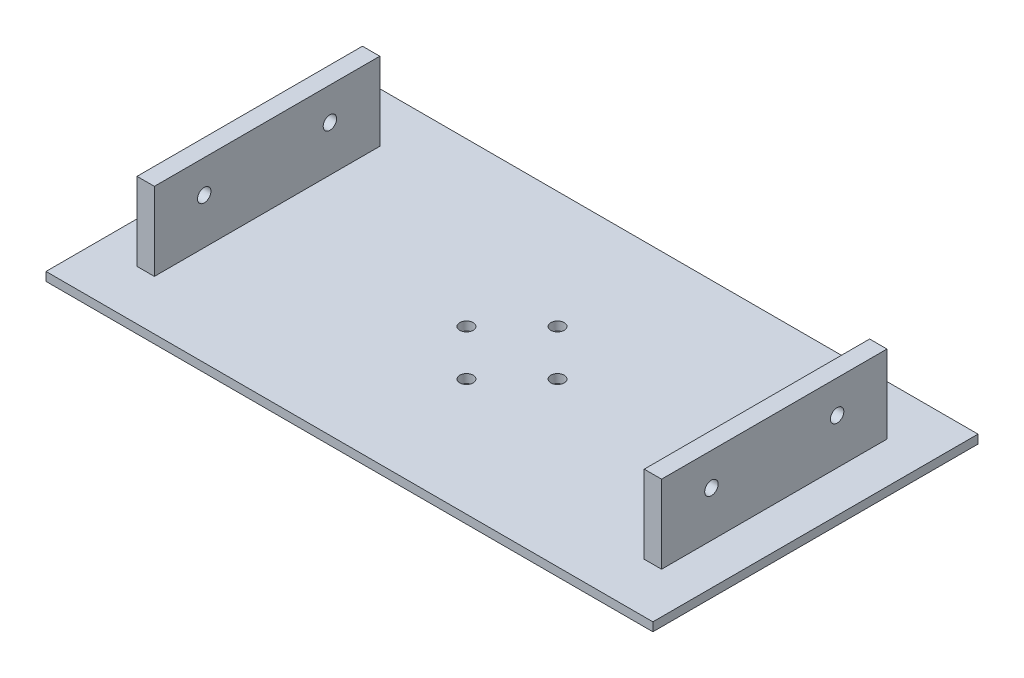
ISO-10303-21;
HEADER;
FILE_DESCRIPTION(('STEP AP214'),'2;1');
FILE_NAME('part.step','',(''),(''),'','','');
FILE_SCHEMA(('AUTOMOTIVE_DESIGN { 1 0 10303 214 1 1 1 1 }'));
ENDSEC;
DATA;
#1=APPLICATION_CONTEXT('core data for automotive mechanical design processes');
#2=APPLICATION_PROTOCOL_DEFINITION('international standard','automotive_design',2000,#1);
#3=PRODUCT_CONTEXT('',#1,'mechanical');
#4=PRODUCT('Part','Part','',(#3));
#5=PRODUCT_RELATED_PRODUCT_CATEGORY('part','',(#4));
#6=PRODUCT_DEFINITION_FORMATION('','',#4);
#7=PRODUCT_DEFINITION_CONTEXT('part definition',#1,'design');
#8=PRODUCT_DEFINITION('design','',#6,#7);
#9=PRODUCT_DEFINITION_SHAPE('','',#8);
#10=(LENGTH_UNIT() NAMED_UNIT(*) SI_UNIT(.MILLI.,.METRE.));
#11=(NAMED_UNIT(*) PLANE_ANGLE_UNIT() SI_UNIT($,.RADIAN.));
#12=(NAMED_UNIT(*) SI_UNIT($,.STERADIAN.) SOLID_ANGLE_UNIT());
#13=UNCERTAINTY_MEASURE_WITH_UNIT(LENGTH_MEASURE(1.E-05),#10,'distance_accuracy_value','');
#14=(GEOMETRIC_REPRESENTATION_CONTEXT(3) GLOBAL_UNCERTAINTY_ASSIGNED_CONTEXT((#13)) GLOBAL_UNIT_ASSIGNED_CONTEXT((#10,
#11,#12)) REPRESENTATION_CONTEXT('',''));
#15=CARTESIAN_POINT('',(0.,0.,0.));
#16=DIRECTION('',(0.,0.,1.));
#17=DIRECTION('',(1.,0.,0.));
#18=AXIS2_PLACEMENT_3D('',#15,#16,#17);
#19=CARTESIAN_POINT('',(0.,2.,0.));
#20=DIRECTION('',(0.,-1.,0.));
#21=DIRECTION('',(0.,0.,-1.));
#22=AXIS2_PLACEMENT_3D('',#19,#20,#21);
#23=PLANE('',#22);
#24=CARTESIAN_POINT('',(0.,2.,10.5));
#25=DIRECTION('',(0.,-1.,0.));
#26=DIRECTION('',(0.,0.,-1.));
#27=AXIS2_PLACEMENT_3D('',#24,#25,#26);
#28=CIRCLE('',#27,1.55);
#29=CARTESIAN_POINT('',(0.,2.,8.95000000000001));
#30=VERTEX_POINT('',#29);
#31=EDGE_CURVE('E552',#30,#30,#28,.T.);
#32=ORIENTED_EDGE('',*,*,#31,.T.);
#33=EDGE_LOOP('',(#32));
#34=FACE_BOUND('',#33,.T.);
#35=CARTESIAN_POINT('',(10.5,2.,0.));
#36=DIRECTION('',(0.,-1.,0.));
#37=DIRECTION('',(0.,0.,-1.));
#38=AXIS2_PLACEMENT_3D('',#35,#36,#37);
#39=CIRCLE('',#38,1.55);
#40=CARTESIAN_POINT('',(10.5,2.,-1.54999999999999));
#41=VERTEX_POINT('',#40);
#42=EDGE_CURVE('E555',#41,#41,#39,.T.);
#43=ORIENTED_EDGE('',*,*,#42,.T.);
#44=EDGE_LOOP('',(#43));
#45=FACE_BOUND('',#44,.T.);
#46=CARTESIAN_POINT('',(-10.5,2.,0.));
#47=DIRECTION('',(0.,-1.,0.));
#48=DIRECTION('',(0.,0.,-1.));
#49=AXIS2_PLACEMENT_3D('',#46,#47,#48);
#50=CIRCLE('',#49,1.55);
#51=CARTESIAN_POINT('',(-10.5,2.,-1.54999999999999));
#52=VERTEX_POINT('',#51);
#53=EDGE_CURVE('E563',#52,#52,#50,.T.);
#54=ORIENTED_EDGE('',*,*,#53,.T.);
#55=EDGE_LOOP('',(#54));
#56=FACE_BOUND('',#55,.T.);
#57=CARTESIAN_POINT('',(0.,2.,-10.5));
#58=DIRECTION('',(0.,-1.,0.));
#59=DIRECTION('',(0.,0.,-1.));
#60=AXIS2_PLACEMENT_3D('',#57,#58,#59);
#61=CIRCLE('',#60,1.55);
#62=CARTESIAN_POINT('',(0.,2.,-12.05));
#63=VERTEX_POINT('',#62);
#64=EDGE_CURVE('E630',#63,#63,#61,.T.);
#65=ORIENTED_EDGE('',*,*,#64,.T.);
#66=EDGE_LOOP('',(#65));
#67=FACE_BOUND('',#66,.T.);
#68=DIRECTION('',(0.,0.,1.));
#69=VECTOR('',#68,1.);
#70=CARTESIAN_POINT('',(56.5,2.,-26.));
#71=LINE('',#70,#69);
#72=CARTESIAN_POINT('',(56.5,2.,-26.));
#73=VERTEX_POINT('',#72);
#74=CARTESIAN_POINT('',(56.5,2.,26.));
#75=VERTEX_POINT('',#74);
#76=EDGE_CURVE('E134',#73,#75,#71,.T.);
#77=ORIENTED_EDGE('',*,*,#76,.F.);
#78=DIRECTION('',(-1.,0.,0.));
#79=VECTOR('',#78,1.);
#80=CARTESIAN_POINT('',(60.5,2.,-26.));
#81=LINE('',#80,#79);
#82=CARTESIAN_POINT('',(60.5,2.,-26.));
#83=VERTEX_POINT('',#82);
#84=EDGE_CURVE('E177',#83,#73,#81,.T.);
#85=ORIENTED_EDGE('',*,*,#84,.F.);
#86=DIRECTION('',(0.,0.,-1.));
#87=VECTOR('',#86,1.);
#88=CARTESIAN_POINT('',(60.5,2.,-26.));
#89=LINE('',#88,#87);
#90=CARTESIAN_POINT('',(60.5,2.,26.));
#91=VERTEX_POINT('',#90);
#92=EDGE_CURVE('E194',#91,#83,#89,.T.);
#93=ORIENTED_EDGE('',*,*,#92,.F.);
#94=DIRECTION('',(1.,0.,0.));
#95=VECTOR('',#94,1.);
#96=CARTESIAN_POINT('',(56.5,2.,26.));
#97=LINE('',#96,#95);
#98=EDGE_CURVE('E190',#75,#91,#97,.T.);
#99=ORIENTED_EDGE('',*,*,#98,.F.);
#100=EDGE_LOOP('',(#77,#85,#93,#99));
#101=FACE_BOUND('',#100,.T.);
#102=DIRECTION('',(1.,0.,0.));
#103=VECTOR('',#102,1.);
#104=CARTESIAN_POINT('',(-70.,2.,37.5));
#105=LINE('',#104,#103);
#106=CARTESIAN_POINT('',(-70.,2.,37.5));
#107=VERTEX_POINT('',#106);
#108=CARTESIAN_POINT('',(70.,2.,37.5));
#109=VERTEX_POINT('',#108);
#110=EDGE_CURVE('E217',#107,#109,#105,.T.);
#111=ORIENTED_EDGE('',*,*,#110,.T.);
#112=DIRECTION('',(0.,0.,1.));
#113=VECTOR('',#112,1.);
#114=CARTESIAN_POINT('',(70.,2.,-37.5));
#115=LINE('',#114,#113);
#116=CARTESIAN_POINT('',(70.,2.,-37.5));
#117=VERTEX_POINT('',#116);
#118=EDGE_CURVE('E220',#117,#109,#115,.T.);
#119=ORIENTED_EDGE('',*,*,#118,.F.);
#120=DIRECTION('',(1.,0.,0.));
#121=VECTOR('',#120,1.);
#122=CARTESIAN_POINT('',(-70.,2.,-37.5));
#123=LINE('',#122,#121);
#124=CARTESIAN_POINT('',(-70.,2.,-37.5));
#125=VERTEX_POINT('',#124);
#126=EDGE_CURVE('E225',#125,#117,#123,.T.);
#127=ORIENTED_EDGE('',*,*,#126,.F.);
#128=DIRECTION('',(0.,0.,1.));
#129=VECTOR('',#128,1.);
#130=CARTESIAN_POINT('',(-70.,2.,-37.5));
#131=LINE('',#130,#129);
#132=EDGE_CURVE('E229',#125,#107,#131,.T.);
#133=ORIENTED_EDGE('',*,*,#132,.T.);
#134=EDGE_LOOP('',(#111,#119,#127,#133));
#135=FACE_BOUND('',#134,.T.);
#136=DIRECTION('',(0.,0.,-1.));
#137=VECTOR('',#136,1.);
#138=CARTESIAN_POINT('',(-56.5,2.,-26.));
#139=LINE('',#138,#137);
#140=CARTESIAN_POINT('',(-56.5,2.,26.));
#141=VERTEX_POINT('',#140);
#142=CARTESIAN_POINT('',(-56.5,2.,-26.));
#143=VERTEX_POINT('',#142);
#144=EDGE_CURVE('E127',#141,#143,#139,.T.);
#145=ORIENTED_EDGE('',*,*,#144,.F.);
#146=DIRECTION('',(1.,0.,0.));
#147=VECTOR('',#146,1.);
#148=CARTESIAN_POINT('',(-56.5,2.,26.));
#149=LINE('',#148,#147);
#150=CARTESIAN_POINT('',(-60.5,2.,26.));
#151=VERTEX_POINT('',#150);
#152=EDGE_CURVE('E129',#151,#141,#149,.T.);
#153=ORIENTED_EDGE('',*,*,#152,.F.);
#154=DIRECTION('',(0.,0.,1.));
#155=VECTOR('',#154,1.);
#156=CARTESIAN_POINT('',(-60.5,2.,-26.));
#157=LINE('',#156,#155);
#158=CARTESIAN_POINT('',(-60.5,2.,-26.));
#159=VERTEX_POINT('',#158);
#160=EDGE_CURVE('E63',#159,#151,#157,.T.);
#161=ORIENTED_EDGE('',*,*,#160,.F.);
#162=DIRECTION('',(-1.,0.,0.));
#163=VECTOR('',#162,1.);
#164=CARTESIAN_POINT('',(-60.5,2.,-26.));
#165=LINE('',#164,#163);
#166=EDGE_CURVE('E58',#143,#159,#165,.T.);
#167=ORIENTED_EDGE('',*,*,#166,.F.);
#168=EDGE_LOOP('',(#145,#153,#161,#167));
#169=FACE_BOUND('',#168,.T.);
#170=ADVANCED_FACE('F42',(#34,#45,#56,#67,#101,#135,#169),#23,.F.);
#171=CARTESIAN_POINT('',(-70.,2.,37.5));
#172=DIRECTION('',(0.,0.,-1.));
#173=DIRECTION('',(-1.,0.,0.));
#174=AXIS2_PLACEMENT_3D('',#171,#172,#173);
#175=PLANE('',#174);
#176=DIRECTION('',(1.,0.,0.));
#177=VECTOR('',#176,1.);
#178=CARTESIAN_POINT('',(-70.,0.,37.5));
#179=LINE('',#178,#177);
#180=CARTESIAN_POINT('',(-70.,0.,37.5));
#181=VERTEX_POINT('',#180);
#182=CARTESIAN_POINT('',(70.,0.,37.5));
#183=VERTEX_POINT('',#182);
#184=EDGE_CURVE('E216',#181,#183,#179,.T.);
#185=ORIENTED_EDGE('',*,*,#184,.T.);
#186=DIRECTION('',(0.,-1.,0.));
#187=VECTOR('',#186,1.);
#188=CARTESIAN_POINT('',(70.,2.,37.5));
#189=LINE('',#188,#187);
#190=EDGE_CURVE('E11',#109,#183,#189,.T.);
#191=ORIENTED_EDGE('',*,*,#190,.F.);
#192=ORIENTED_EDGE('',*,*,#110,.F.);
#193=DIRECTION('',(0.,-1.,0.));
#194=VECTOR('',#193,1.);
#195=CARTESIAN_POINT('',(-70.,2.,37.5));
#196=LINE('',#195,#194);
#197=EDGE_CURVE('E232',#107,#181,#196,.T.);
#198=ORIENTED_EDGE('',*,*,#197,.T.);
#199=EDGE_LOOP('',(#185,#191,#192,#198));
#200=FACE_BOUND('',#199,.T.);
#201=ADVANCED_FACE('F44',(#200),#175,.F.);
#202=CARTESIAN_POINT('',(70.,2.,-37.5));
#203=DIRECTION('',(1.,0.,0.));
#204=DIRECTION('',(0.,0.,-1.));
#205=AXIS2_PLACEMENT_3D('',#202,#203,#204);
#206=PLANE('',#205);
#207=DIRECTION('',(0.,0.,1.));
#208=VECTOR('',#207,1.);
#209=CARTESIAN_POINT('',(70.,0.,-37.5));
#210=LINE('',#209,#208);
#211=CARTESIAN_POINT('',(70.,0.,-37.5));
#212=VERTEX_POINT('',#211);
#213=EDGE_CURVE('E236',#212,#183,#210,.T.);
#214=ORIENTED_EDGE('',*,*,#213,.F.);
#215=DIRECTION('',(0.,-1.,0.));
#216=VECTOR('',#215,1.);
#217=CARTESIAN_POINT('',(70.,2.,-37.5));
#218=LINE('',#217,#216);
#219=EDGE_CURVE('E51',#117,#212,#218,.T.);
#220=ORIENTED_EDGE('',*,*,#219,.F.);
#221=ORIENTED_EDGE('',*,*,#118,.T.);
#222=ORIENTED_EDGE('',*,*,#190,.T.);
#223=EDGE_LOOP('',(#214,#220,#221,#222));
#224=FACE_BOUND('',#223,.T.);
#225=ADVANCED_FACE('F259',(#224),#206,.T.);
#226=CARTESIAN_POINT('',(-70.,2.,-37.5));
#227=DIRECTION('',(0.,0.,-1.));
#228=DIRECTION('',(-1.,0.,0.));
#229=AXIS2_PLACEMENT_3D('',#226,#227,#228);
#230=PLANE('',#229);
#231=DIRECTION('',(1.,0.,0.));
#232=VECTOR('',#231,1.);
#233=CARTESIAN_POINT('',(-70.,0.,-37.5));
#234=LINE('',#233,#232);
#235=CARTESIAN_POINT('',(-70.,0.,-37.5));
#236=VERTEX_POINT('',#235);
#237=EDGE_CURVE('E240',#236,#212,#234,.T.);
#238=ORIENTED_EDGE('',*,*,#237,.F.);
#239=DIRECTION('',(0.,-1.,0.));
#240=VECTOR('',#239,1.);
#241=CARTESIAN_POINT('',(-70.,2.,-37.5));
#242=LINE('',#241,#240);
#243=EDGE_CURVE('E249',#125,#236,#242,.T.);
#244=ORIENTED_EDGE('',*,*,#243,.F.);
#245=ORIENTED_EDGE('',*,*,#126,.T.);
#246=ORIENTED_EDGE('',*,*,#219,.T.);
#247=EDGE_LOOP('',(#238,#244,#245,#246));
#248=FACE_BOUND('',#247,.T.);
#249=ADVANCED_FACE('F255',(#248),#230,.T.);
#250=CARTESIAN_POINT('',(-70.,2.,-37.5));
#251=DIRECTION('',(1.,0.,0.));
#252=DIRECTION('',(0.,0.,-1.));
#253=AXIS2_PLACEMENT_3D('',#250,#251,#252);
#254=PLANE('',#253);
#255=DIRECTION('',(0.,0.,1.));
#256=VECTOR('',#255,1.);
#257=CARTESIAN_POINT('',(-70.,0.,-37.5));
#258=LINE('',#257,#256);
#259=EDGE_CURVE('E221',#236,#181,#258,.T.);
#260=ORIENTED_EDGE('',*,*,#259,.T.);
#261=ORIENTED_EDGE('',*,*,#197,.F.);
#262=ORIENTED_EDGE('',*,*,#132,.F.);
#263=ORIENTED_EDGE('',*,*,#243,.T.);
#264=EDGE_LOOP('',(#260,#261,#262,#263));
#265=FACE_BOUND('',#264,.T.);
#266=ADVANCED_FACE('F267',(#265),#254,.F.);
#267=CARTESIAN_POINT('',(0.,0.,0.));
#268=DIRECTION('',(0.,-1.,0.));
#269=DIRECTION('',(0.,0.,-1.));
#270=AXIS2_PLACEMENT_3D('',#267,#268,#269);
#271=PLANE('',#270);
#272=CARTESIAN_POINT('',(0.,0.,10.5));
#273=DIRECTION('',(0.,-1.,0.));
#274=DIRECTION('',(0.,0.,-1.));
#275=AXIS2_PLACEMENT_3D('',#272,#273,#274);
#276=CIRCLE('',#275,1.55);
#277=CARTESIAN_POINT('',(0.,0.,8.95000000000001));
#278=VERTEX_POINT('',#277);
#279=EDGE_CURVE('E550',#278,#278,#276,.T.);
#280=ORIENTED_EDGE('',*,*,#279,.F.);
#281=EDGE_LOOP('',(#280));
#282=FACE_BOUND('',#281,.T.);
#283=CARTESIAN_POINT('',(10.5,0.,0.));
#284=DIRECTION('',(0.,-1.,0.));
#285=DIRECTION('',(0.,0.,-1.));
#286=AXIS2_PLACEMENT_3D('',#283,#284,#285);
#287=CIRCLE('',#286,1.55);
#288=CARTESIAN_POINT('',(10.5,0.,-1.54999999999999));
#289=VERTEX_POINT('',#288);
#290=EDGE_CURVE('E642',#289,#289,#287,.T.);
#291=ORIENTED_EDGE('',*,*,#290,.F.);
#292=EDGE_LOOP('',(#291));
#293=FACE_BOUND('',#292,.T.);
#294=CARTESIAN_POINT('',(-10.5,0.,0.));
#295=DIRECTION('',(0.,-1.,0.));
#296=DIRECTION('',(0.,0.,-1.));
#297=AXIS2_PLACEMENT_3D('',#294,#295,#296);
#298=CIRCLE('',#297,1.55);
#299=CARTESIAN_POINT('',(-10.5,0.,-1.54999999999999));
#300=VERTEX_POINT('',#299);
#301=EDGE_CURVE('E638',#300,#300,#298,.T.);
#302=ORIENTED_EDGE('',*,*,#301,.F.);
#303=EDGE_LOOP('',(#302));
#304=FACE_BOUND('',#303,.T.);
#305=CARTESIAN_POINT('',(0.,0.,-10.5));
#306=DIRECTION('',(0.,-1.,0.));
#307=DIRECTION('',(0.,0.,-1.));
#308=AXIS2_PLACEMENT_3D('',#305,#306,#307);
#309=CIRCLE('',#308,1.55);
#310=CARTESIAN_POINT('',(0.,0.,-12.05));
#311=VERTEX_POINT('',#310);
#312=EDGE_CURVE('E634',#311,#311,#309,.T.);
#313=ORIENTED_EDGE('',*,*,#312,.F.);
#314=EDGE_LOOP('',(#313));
#315=FACE_BOUND('',#314,.T.);
#316=ORIENTED_EDGE('',*,*,#184,.F.);
#317=ORIENTED_EDGE('',*,*,#259,.F.);
#318=ORIENTED_EDGE('',*,*,#237,.T.);
#319=ORIENTED_EDGE('',*,*,#213,.T.);
#320=EDGE_LOOP('',(#316,#317,#318,#319));
#321=FACE_BOUND('',#320,.T.);
#322=ADVANCED_FACE('F264',(#282,#293,#304,#315,#321),#271,.T.);
#323=CARTESIAN_POINT('',(56.5,20.,-26.));
#324=DIRECTION('',(1.,0.,0.));
#325=DIRECTION('',(0.,0.,-1.));
#326=AXIS2_PLACEMENT_3D('',#323,#324,#325);
#327=PLANE('',#326);
#328=CARTESIAN_POINT('',(56.5,12.5,-14.5));
#329=DIRECTION('',(1.,0.,0.));
#330=DIRECTION('',(0.,0.,-1.));
#331=AXIS2_PLACEMENT_3D('',#328,#329,#330);
#332=CIRCLE('',#331,1.55);
#333=CARTESIAN_POINT('',(56.5,12.5,-16.05));
#334=VERTEX_POINT('',#333);
#335=EDGE_CURVE('E574',#334,#334,#332,.F.);
#336=ORIENTED_EDGE('',*,*,#335,.F.);
#337=EDGE_LOOP('',(#336));
#338=FACE_BOUND('',#337,.T.);
#339=CARTESIAN_POINT('',(56.5,12.5,14.5));
#340=DIRECTION('',(1.,0.,0.));
#341=DIRECTION('',(0.,0.,-1.));
#342=AXIS2_PLACEMENT_3D('',#339,#340,#341);
#343=CIRCLE('',#342,1.55);
#344=CARTESIAN_POINT('',(56.5,12.5,12.95));
#345=VERTEX_POINT('',#344);
#346=EDGE_CURVE('E569',#345,#345,#343,.F.);
#347=ORIENTED_EDGE('',*,*,#346,.F.);
#348=EDGE_LOOP('',(#347));
#349=FACE_BOUND('',#348,.T.);
#350=ORIENTED_EDGE('',*,*,#76,.T.);
#351=DIRECTION('',(0.,-1.,0.));
#352=VECTOR('',#351,1.);
#353=CARTESIAN_POINT('',(56.5,20.,26.));
#354=LINE('',#353,#352);
#355=CARTESIAN_POINT('',(56.5,20.,26.));
#356=VERTEX_POINT('',#355);
#357=EDGE_CURVE('E212',#356,#75,#354,.T.);
#358=ORIENTED_EDGE('',*,*,#357,.F.);
#359=DIRECTION('',(0.,0.,1.));
#360=VECTOR('',#359,1.);
#361=CARTESIAN_POINT('',(56.5,20.,-26.));
#362=LINE('',#361,#360);
#363=CARTESIAN_POINT('',(56.5,20.,-26.));
#364=VERTEX_POINT('',#363);
#365=EDGE_CURVE('E172',#364,#356,#362,.T.);
#366=ORIENTED_EDGE('',*,*,#365,.F.);
#367=DIRECTION('',(0.,-1.,0.));
#368=VECTOR('',#367,1.);
#369=CARTESIAN_POINT('',(56.5,20.,-26.));
#370=LINE('',#369,#368);
#371=EDGE_CURVE('E186',#364,#73,#370,.T.);
#372=ORIENTED_EDGE('',*,*,#371,.T.);
#373=EDGE_LOOP('',(#350,#358,#366,#372));
#374=FACE_BOUND('',#373,.T.);
#375=ADVANCED_FACE('F282',(#338,#349,#374),#327,.F.);
#376=CARTESIAN_POINT('',(56.5,20.,26.));
#377=DIRECTION('',(0.,0.,-1.));
#378=DIRECTION('',(-1.,0.,0.));
#379=AXIS2_PLACEMENT_3D('',#376,#377,#378);
#380=PLANE('',#379);
#381=ORIENTED_EDGE('',*,*,#98,.T.);
#382=DIRECTION('',(0.,-1.,0.));
#383=VECTOR('',#382,1.);
#384=CARTESIAN_POINT('',(60.5,20.,26.));
#385=LINE('',#384,#383);
#386=CARTESIAN_POINT('',(60.5,20.,26.));
#387=VERTEX_POINT('',#386);
#388=EDGE_CURVE('E208',#387,#91,#385,.T.);
#389=ORIENTED_EDGE('',*,*,#388,.F.);
#390=DIRECTION('',(1.,0.,0.));
#391=VECTOR('',#390,1.);
#392=CARTESIAN_POINT('',(56.5,20.,26.));
#393=LINE('',#392,#391);
#394=EDGE_CURVE('E176',#356,#387,#393,.T.);
#395=ORIENTED_EDGE('',*,*,#394,.F.);
#396=ORIENTED_EDGE('',*,*,#357,.T.);
#397=EDGE_LOOP('',(#381,#389,#395,#396));
#398=FACE_BOUND('',#397,.T.);
#399=ADVANCED_FACE('F315',(#398),#380,.F.);
#400=CARTESIAN_POINT('',(60.5,20.,-26.));
#401=DIRECTION('',(-1.,0.,0.));
#402=DIRECTION('',(0.,0.,1.));
#403=AXIS2_PLACEMENT_3D('',#400,#401,#402);
#404=PLANE('',#403);
#405=CARTESIAN_POINT('',(60.5,12.5,-14.5));
#406=DIRECTION('',(-1.,0.,0.));
#407=DIRECTION('',(0.,0.,1.));
#408=AXIS2_PLACEMENT_3D('',#405,#406,#407);
#409=CIRCLE('',#408,1.55);
#410=CARTESIAN_POINT('',(60.5,12.5,-12.95));
#411=VERTEX_POINT('',#410);
#412=EDGE_CURVE('E560',#411,#411,#409,.T.);
#413=ORIENTED_EDGE('',*,*,#412,.T.);
#414=EDGE_LOOP('',(#413));
#415=FACE_BOUND('',#414,.T.);
#416=CARTESIAN_POINT('',(60.5,12.5,14.5));
#417=DIRECTION('',(-1.,0.,0.));
#418=DIRECTION('',(0.,0.,-1.));
#419=AXIS2_PLACEMENT_3D('',#416,#417,#418);
#420=CIRCLE('',#419,1.55);
#421=CARTESIAN_POINT('',(60.5,12.5,12.95));
#422=VERTEX_POINT('',#421);
#423=EDGE_CURVE('E554',#422,#422,#420,.T.);
#424=ORIENTED_EDGE('',*,*,#423,.T.);
#425=EDGE_LOOP('',(#424));
#426=FACE_BOUND('',#425,.T.);
#427=ORIENTED_EDGE('',*,*,#92,.T.);
#428=DIRECTION('',(0.,-1.,0.));
#429=VECTOR('',#428,1.);
#430=CARTESIAN_POINT('',(60.5,20.,-26.));
#431=LINE('',#430,#429);
#432=CARTESIAN_POINT('',(60.5,20.,-26.));
#433=VERTEX_POINT('',#432);
#434=EDGE_CURVE('E204',#433,#83,#431,.T.);
#435=ORIENTED_EDGE('',*,*,#434,.F.);
#436=DIRECTION('',(0.,0.,-1.));
#437=VECTOR('',#436,1.);
#438=CARTESIAN_POINT('',(60.5,20.,-26.));
#439=LINE('',#438,#437);
#440=EDGE_CURVE('E180',#387,#433,#439,.T.);
#441=ORIENTED_EDGE('',*,*,#440,.F.);
#442=ORIENTED_EDGE('',*,*,#388,.T.);
#443=EDGE_LOOP('',(#427,#435,#441,#442));
#444=FACE_BOUND('',#443,.T.);
#445=ADVANCED_FACE('F323',(#415,#426,#444),#404,.F.);
#446=CARTESIAN_POINT('',(60.5,20.,-26.));
#447=DIRECTION('',(0.,0.,1.));
#448=DIRECTION('',(1.,0.,0.));
#449=AXIS2_PLACEMENT_3D('',#446,#447,#448);
#450=PLANE('',#449);
#451=ORIENTED_EDGE('',*,*,#84,.T.);
#452=ORIENTED_EDGE('',*,*,#371,.F.);
#453=DIRECTION('',(-1.,0.,0.));
#454=VECTOR('',#453,1.);
#455=CARTESIAN_POINT('',(60.5,20.,-26.));
#456=LINE('',#455,#454);
#457=EDGE_CURVE('E183',#433,#364,#456,.T.);
#458=ORIENTED_EDGE('',*,*,#457,.F.);
#459=ORIENTED_EDGE('',*,*,#434,.T.);
#460=EDGE_LOOP('',(#451,#452,#458,#459));
#461=FACE_BOUND('',#460,.T.);
#462=ADVANCED_FACE('F330',(#461),#450,.F.);
#463=CARTESIAN_POINT('',(0.,20.,0.));
#464=DIRECTION('',(0.,1.,0.));
#465=DIRECTION('',(0.,0.,1.));
#466=AXIS2_PLACEMENT_3D('',#463,#464,#465);
#467=PLANE('',#466);
#468=ORIENTED_EDGE('',*,*,#365,.T.);
#469=ORIENTED_EDGE('',*,*,#394,.T.);
#470=ORIENTED_EDGE('',*,*,#440,.T.);
#471=ORIENTED_EDGE('',*,*,#457,.T.);
#472=EDGE_LOOP('',(#468,#469,#470,#471));
#473=FACE_BOUND('',#472,.T.);
#474=ADVANCED_FACE('F338',(#473),#467,.T.);
#475=CARTESIAN_POINT('',(-56.5,20.,-26.));
#476=DIRECTION('',(-1.,0.,0.));
#477=DIRECTION('',(0.,0.,1.));
#478=AXIS2_PLACEMENT_3D('',#475,#476,#477);
#479=PLANE('',#478);
#480=CARTESIAN_POINT('',(-56.5,12.5,-14.5));
#481=DIRECTION('',(-1.,0.,0.));
#482=DIRECTION('',(0.,0.,1.));
#483=AXIS2_PLACEMENT_3D('',#480,#481,#482);
#484=CIRCLE('',#483,1.55);
#485=CARTESIAN_POINT('',(-56.5,12.5,-12.95));
#486=VERTEX_POINT('',#485);
#487=EDGE_CURVE('E590',#486,#486,#484,.T.);
#488=ORIENTED_EDGE('',*,*,#487,.T.);
#489=EDGE_LOOP('',(#488));
#490=FACE_BOUND('',#489,.T.);
#491=CARTESIAN_POINT('',(-56.5,12.5,14.5));
#492=DIRECTION('',(-1.,0.,0.));
#493=DIRECTION('',(0.,0.,1.));
#494=AXIS2_PLACEMENT_3D('',#491,#492,#493);
#495=CIRCLE('',#494,1.55);
#496=CARTESIAN_POINT('',(-56.5,12.5,16.05));
#497=VERTEX_POINT('',#496);
#498=EDGE_CURVE('E583',#497,#497,#495,.T.);
#499=ORIENTED_EDGE('',*,*,#498,.T.);
#500=EDGE_LOOP('',(#499));
#501=FACE_BOUND('',#500,.T.);
#502=ORIENTED_EDGE('',*,*,#144,.T.);
#503=DIRECTION('',(0.,-1.,0.));
#504=VECTOR('',#503,1.);
#505=CARTESIAN_POINT('',(-56.5,20.,-26.));
#506=LINE('',#505,#504);
#507=CARTESIAN_POINT('',(-56.5,20.,-26.));
#508=VERTEX_POINT('',#507);
#509=EDGE_CURVE('E594',#508,#143,#506,.T.);
#510=ORIENTED_EDGE('',*,*,#509,.F.);
#511=DIRECTION('',(0.,0.,-1.));
#512=VECTOR('',#511,1.);
#513=CARTESIAN_POINT('',(-56.5,20.,-26.));
#514=LINE('',#513,#512);
#515=CARTESIAN_POINT('',(-56.5,20.,26.));
#516=VERTEX_POINT('',#515);
#517=EDGE_CURVE('E146',#516,#508,#514,.T.);
#518=ORIENTED_EDGE('',*,*,#517,.F.);
#519=DIRECTION('',(0.,-1.,0.));
#520=VECTOR('',#519,1.);
#521=CARTESIAN_POINT('',(-56.5,20.,26.));
#522=LINE('',#521,#520);
#523=EDGE_CURVE('E141',#516,#141,#522,.T.);
#524=ORIENTED_EDGE('',*,*,#523,.T.);
#525=EDGE_LOOP('',(#502,#510,#518,#524));
#526=FACE_BOUND('',#525,.T.);
#527=ADVANCED_FACE('F148',(#490,#501,#526),#479,.F.);
#528=CARTESIAN_POINT('',(-60.5,20.,-26.));
#529=DIRECTION('',(0.,0.,1.));
#530=DIRECTION('',(1.,0.,0.));
#531=AXIS2_PLACEMENT_3D('',#528,#529,#530);
#532=PLANE('',#531);
#533=ORIENTED_EDGE('',*,*,#166,.T.);
#534=DIRECTION('',(0.,-1.,0.));
#535=VECTOR('',#534,1.);
#536=CARTESIAN_POINT('',(-60.5,20.,-26.));
#537=LINE('',#536,#535);
#538=CARTESIAN_POINT('',(-60.5,20.,-26.));
#539=VERTEX_POINT('',#538);
#540=EDGE_CURVE('E157',#539,#159,#537,.T.);
#541=ORIENTED_EDGE('',*,*,#540,.F.);
#542=DIRECTION('',(-1.,0.,0.));
#543=VECTOR('',#542,1.);
#544=CARTESIAN_POINT('',(-60.5,20.,-26.));
#545=LINE('',#544,#543);
#546=EDGE_CURVE('E167',#508,#539,#545,.T.);
#547=ORIENTED_EDGE('',*,*,#546,.F.);
#548=ORIENTED_EDGE('',*,*,#509,.T.);
#549=EDGE_LOOP('',(#533,#541,#547,#548));
#550=FACE_BOUND('',#549,.T.);
#551=ADVANCED_FACE('F354',(#550),#532,.F.);
#552=CARTESIAN_POINT('',(-60.5,20.,-26.));
#553=DIRECTION('',(1.,0.,0.));
#554=DIRECTION('',(0.,0.,-1.));
#555=AXIS2_PLACEMENT_3D('',#552,#553,#554);
#556=PLANE('',#555);
#557=CARTESIAN_POINT('',(-60.5,12.5,-14.5));
#558=DIRECTION('',(-1.,0.,0.));
#559=DIRECTION('',(0.,0.,1.));
#560=AXIS2_PLACEMENT_3D('',#557,#558,#559);
#561=CIRCLE('',#560,1.55);
#562=CARTESIAN_POINT('',(-60.5,12.5,-12.95));
#563=VERTEX_POINT('',#562);
#564=EDGE_CURVE('E579',#563,#563,#561,.T.);
#565=ORIENTED_EDGE('',*,*,#564,.F.);
#566=EDGE_LOOP('',(#565));
#567=FACE_BOUND('',#566,.T.);
#568=CARTESIAN_POINT('',(-60.5,12.5,14.5));
#569=DIRECTION('',(-1.,0.,0.));
#570=DIRECTION('',(0.,0.,-1.));
#571=AXIS2_PLACEMENT_3D('',#568,#569,#570);
#572=CIRCLE('',#571,1.55);
#573=CARTESIAN_POINT('',(-60.5,12.5,12.95));
#574=VERTEX_POINT('',#573);
#575=EDGE_CURVE('E578',#574,#574,#572,.T.);
#576=ORIENTED_EDGE('',*,*,#575,.F.);
#577=EDGE_LOOP('',(#576));
#578=FACE_BOUND('',#577,.T.);
#579=ORIENTED_EDGE('',*,*,#160,.T.);
#580=DIRECTION('',(0.,-1.,0.));
#581=VECTOR('',#580,1.);
#582=CARTESIAN_POINT('',(-60.5,20.,26.));
#583=LINE('',#582,#581);
#584=CARTESIAN_POINT('',(-60.5,20.,26.));
#585=VERTEX_POINT('',#584);
#586=EDGE_CURVE('E144',#585,#151,#583,.T.);
#587=ORIENTED_EDGE('',*,*,#586,.F.);
#588=DIRECTION('',(0.,0.,1.));
#589=VECTOR('',#588,1.);
#590=CARTESIAN_POINT('',(-60.5,20.,-26.));
#591=LINE('',#590,#589);
#592=EDGE_CURVE('E155',#539,#585,#591,.T.);
#593=ORIENTED_EDGE('',*,*,#592,.F.);
#594=ORIENTED_EDGE('',*,*,#540,.T.);
#595=EDGE_LOOP('',(#579,#587,#593,#594));
#596=FACE_BOUND('',#595,.T.);
#597=ADVANCED_FACE('F363',(#567,#578,#596),#556,.F.);
#598=CARTESIAN_POINT('',(-56.5,20.,26.));
#599=DIRECTION('',(0.,0.,-1.));
#600=DIRECTION('',(-1.,0.,0.));
#601=AXIS2_PLACEMENT_3D('',#598,#599,#600);
#602=PLANE('',#601);
#603=ORIENTED_EDGE('',*,*,#152,.T.);
#604=ORIENTED_EDGE('',*,*,#523,.F.);
#605=DIRECTION('',(1.,0.,0.));
#606=VECTOR('',#605,1.);
#607=CARTESIAN_POINT('',(-56.5,20.,26.));
#608=LINE('',#607,#606);
#609=EDGE_CURVE('E151',#585,#516,#608,.T.);
#610=ORIENTED_EDGE('',*,*,#609,.F.);
#611=ORIENTED_EDGE('',*,*,#586,.T.);
#612=EDGE_LOOP('',(#603,#604,#610,#611));
#613=FACE_BOUND('',#612,.T.);
#614=ADVANCED_FACE('F139',(#613),#602,.F.);
#615=CARTESIAN_POINT('',(0.,20.,0.));
#616=DIRECTION('',(0.,-1.,0.));
#617=DIRECTION('',(0.,0.,-1.));
#618=AXIS2_PLACEMENT_3D('',#615,#616,#617);
#619=PLANE('',#618);
#620=ORIENTED_EDGE('',*,*,#517,.T.);
#621=ORIENTED_EDGE('',*,*,#546,.T.);
#622=ORIENTED_EDGE('',*,*,#592,.T.);
#623=ORIENTED_EDGE('',*,*,#609,.T.);
#624=EDGE_LOOP('',(#620,#621,#622,#623));
#625=FACE_BOUND('',#624,.T.);
#626=ADVANCED_FACE('F378',(#625),#619,.F.);
#627=CARTESIAN_POINT('',(-45.5,12.5,14.5));
#628=DIRECTION('',(-1.,0.,0.));
#629=DIRECTION('',(0.,0.,1.));
#630=AXIS2_PLACEMENT_3D('',#627,#628,#629);
#631=CYLINDRICAL_SURFACE('',#630,1.55);
#632=ORIENTED_EDGE('',*,*,#575,.T.);
#633=EDGE_LOOP('',(#632));
#634=FACE_BOUND('',#633,.T.);
#635=ORIENTED_EDGE('',*,*,#498,.F.);
#636=EDGE_LOOP('',(#635));
#637=FACE_BOUND('',#636,.T.);
#638=ADVANCED_FACE('F384',(#634,#637),#631,.F.);
#639=CARTESIAN_POINT('',(-45.5,12.5,-14.5));
#640=DIRECTION('',(-1.,0.,0.));
#641=DIRECTION('',(0.,0.,1.));
#642=AXIS2_PLACEMENT_3D('',#639,#640,#641);
#643=CYLINDRICAL_SURFACE('',#642,1.55);
#644=ORIENTED_EDGE('',*,*,#564,.T.);
#645=EDGE_LOOP('',(#644));
#646=FACE_BOUND('',#645,.T.);
#647=ORIENTED_EDGE('',*,*,#487,.F.);
#648=EDGE_LOOP('',(#647));
#649=FACE_BOUND('',#648,.T.);
#650=ADVANCED_FACE('F391',(#646,#649),#643,.F.);
#651=CARTESIAN_POINT('',(45.5,12.5,14.5));
#652=DIRECTION('',(1.,0.,0.));
#653=DIRECTION('',(0.,0.,-1.));
#654=AXIS2_PLACEMENT_3D('',#651,#652,#653);
#655=CYLINDRICAL_SURFACE('',#654,1.55);
#656=ORIENTED_EDGE('',*,*,#423,.F.);
#657=EDGE_LOOP('',(#656));
#658=FACE_BOUND('',#657,.T.);
#659=ORIENTED_EDGE('',*,*,#346,.T.);
#660=EDGE_LOOP('',(#659));
#661=FACE_BOUND('',#660,.T.);
#662=ADVANCED_FACE('F398',(#658,#661),#655,.F.);
#663=CARTESIAN_POINT('',(45.5,12.5,-14.5));
#664=DIRECTION('',(1.,0.,0.));
#665=DIRECTION('',(0.,0.,-1.));
#666=AXIS2_PLACEMENT_3D('',#663,#664,#665);
#667=CYLINDRICAL_SURFACE('',#666,1.55);
#668=ORIENTED_EDGE('',*,*,#412,.F.);
#669=EDGE_LOOP('',(#668));
#670=FACE_BOUND('',#669,.T.);
#671=ORIENTED_EDGE('',*,*,#335,.T.);
#672=EDGE_LOOP('',(#671));
#673=FACE_BOUND('',#672,.T.);
#674=ADVANCED_FACE('F405',(#670,#673),#667,.F.);
#675=CARTESIAN_POINT('',(0.,15.,-10.5));
#676=DIRECTION('',(0.,-1.,0.));
#677=DIRECTION('',(0.,0.,-1.));
#678=AXIS2_PLACEMENT_3D('',#675,#676,#677);
#679=CYLINDRICAL_SURFACE('',#678,1.55);
#680=ORIENTED_EDGE('',*,*,#312,.T.);
#681=EDGE_LOOP('',(#680));
#682=FACE_BOUND('',#681,.T.);
#683=ORIENTED_EDGE('',*,*,#64,.F.);
#684=EDGE_LOOP('',(#683));
#685=FACE_BOUND('',#684,.T.);
#686=ADVANCED_FACE('F413',(#682,#685),#679,.F.);
#687=CARTESIAN_POINT('',(-10.5,15.,0.));
#688=DIRECTION('',(0.,-1.,0.));
#689=DIRECTION('',(0.,0.,-1.));
#690=AXIS2_PLACEMENT_3D('',#687,#688,#689);
#691=CYLINDRICAL_SURFACE('',#690,1.55);
#692=ORIENTED_EDGE('',*,*,#301,.T.);
#693=EDGE_LOOP('',(#692));
#694=FACE_BOUND('',#693,.T.);
#695=ORIENTED_EDGE('',*,*,#53,.F.);
#696=EDGE_LOOP('',(#695));
#697=FACE_BOUND('',#696,.T.);
#698=ADVANCED_FACE('F420',(#694,#697),#691,.F.);
#699=CARTESIAN_POINT('',(10.5,15.,0.));
#700=DIRECTION('',(0.,-1.,0.));
#701=DIRECTION('',(0.,0.,-1.));
#702=AXIS2_PLACEMENT_3D('',#699,#700,#701);
#703=CYLINDRICAL_SURFACE('',#702,1.55);
#704=ORIENTED_EDGE('',*,*,#290,.T.);
#705=EDGE_LOOP('',(#704));
#706=FACE_BOUND('',#705,.T.);
#707=ORIENTED_EDGE('',*,*,#42,.F.);
#708=EDGE_LOOP('',(#707));
#709=FACE_BOUND('',#708,.T.);
#710=ADVANCED_FACE('F428',(#706,#709),#703,.F.);
#711=CARTESIAN_POINT('',(0.,15.,10.5));
#712=DIRECTION('',(0.,-1.,0.));
#713=DIRECTION('',(0.,0.,-1.));
#714=AXIS2_PLACEMENT_3D('',#711,#712,#713);
#715=CYLINDRICAL_SURFACE('',#714,1.55);
#716=ORIENTED_EDGE('',*,*,#279,.T.);
#717=EDGE_LOOP('',(#716));
#718=FACE_BOUND('',#717,.T.);
#719=ORIENTED_EDGE('',*,*,#31,.F.);
#720=EDGE_LOOP('',(#719));
#721=FACE_BOUND('',#720,.T.);
#722=ADVANCED_FACE('F436',(#718,#721),#715,.F.);
#723=CLOSED_SHELL('',(#170,#201,#225,#249,#266,#322,#375,#399,#445,#462,#474,#527,#551,#597,
#614,#626,#638,#650,#662,#674,#686,#698,#710,#722));
#724=MANIFOLD_SOLID_BREP('B2',#723);
#725=ADVANCED_BREP_SHAPE_REPRESENTATION('',(#18,#724),#14);
#726=SHAPE_DEFINITION_REPRESENTATION(#9,#725);
ENDSEC;
END-ISO-10303-21;
